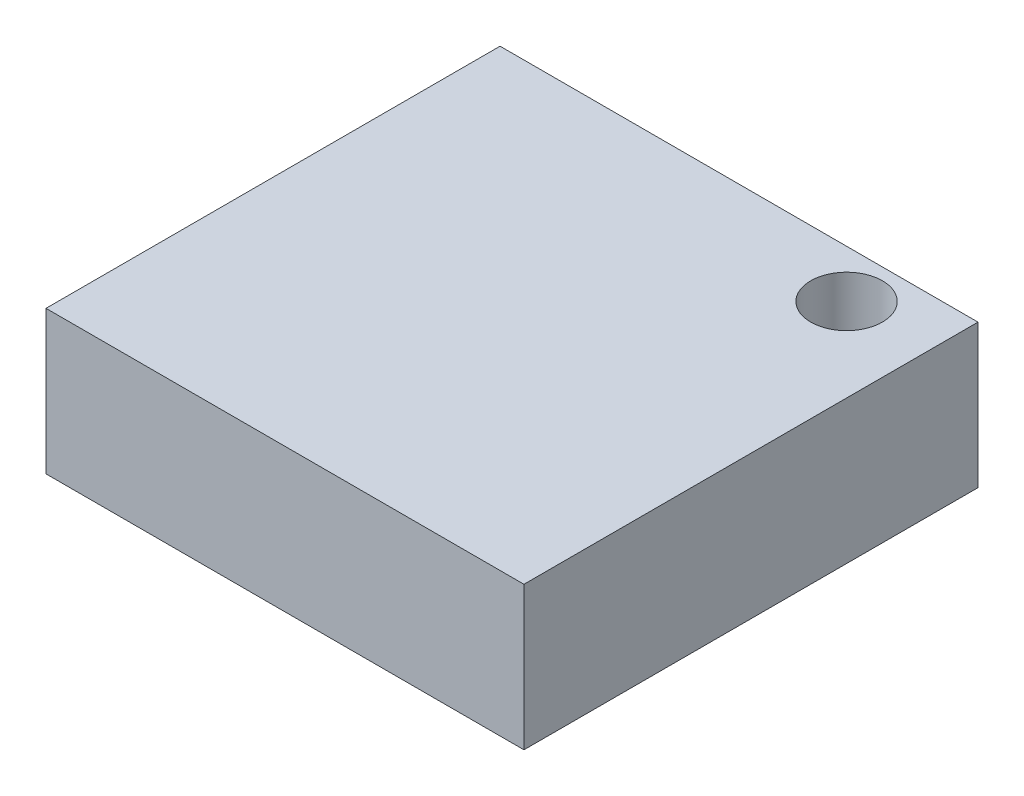
ISO-10303-21;
HEADER;
FILE_DESCRIPTION(('STEP AP214'),'2;1');
FILE_NAME('part.step','',(''),(''),'','','');
FILE_SCHEMA(('AUTOMOTIVE_DESIGN { 1 0 10303 214 1 1 1 1 }'));
ENDSEC;
DATA;
#1=APPLICATION_CONTEXT('core data for automotive mechanical design processes');
#2=APPLICATION_PROTOCOL_DEFINITION('international standard','automotive_design',2000,#1);
#3=PRODUCT_CONTEXT('',#1,'mechanical');
#4=PRODUCT('Part','Part','',(#3));
#5=PRODUCT_RELATED_PRODUCT_CATEGORY('part','',(#4));
#6=PRODUCT_DEFINITION_FORMATION('','',#4);
#7=PRODUCT_DEFINITION_CONTEXT('part definition',#1,'design');
#8=PRODUCT_DEFINITION('design','',#6,#7);
#9=PRODUCT_DEFINITION_SHAPE('','',#8);
#10=(LENGTH_UNIT() NAMED_UNIT(*) SI_UNIT(.MILLI.,.METRE.));
#11=(NAMED_UNIT(*) PLANE_ANGLE_UNIT() SI_UNIT($,.RADIAN.));
#12=(NAMED_UNIT(*) SI_UNIT($,.STERADIAN.) SOLID_ANGLE_UNIT());
#13=UNCERTAINTY_MEASURE_WITH_UNIT(LENGTH_MEASURE(1.E-05),#10,'distance_accuracy_value','');
#14=(GEOMETRIC_REPRESENTATION_CONTEXT(3) GLOBAL_UNCERTAINTY_ASSIGNED_CONTEXT((#13)) GLOBAL_UNIT_ASSIGNED_CONTEXT((#10,
#11,#12)) REPRESENTATION_CONTEXT('',''));
#15=CARTESIAN_POINT('',(0.,0.,0.));
#16=DIRECTION('',(0.,0.,1.));
#17=DIRECTION('',(1.,0.,0.));
#18=AXIS2_PLACEMENT_3D('',#15,#16,#17);
#19=CARTESIAN_POINT('',(0.,6.,0.));
#20=DIRECTION('',(1.,0.,0.));
#21=DIRECTION('',(0.,0.,-1.));
#22=AXIS2_PLACEMENT_3D('',#19,#20,#21);
#23=PLANE('',#22);
#24=DIRECTION('',(0.,0.,1.));
#25=VECTOR('',#24,1.);
#26=CARTESIAN_POINT('',(0.,0.,0.));
#27=LINE('',#26,#25);
#28=CARTESIAN_POINT('',(0.,0.,-19.));
#29=VERTEX_POINT('',#28);
#30=CARTESIAN_POINT('',(0.,0.,0.));
#31=VERTEX_POINT('',#30);
#32=EDGE_CURVE('E98',#29,#31,#27,.T.);
#33=ORIENTED_EDGE('',*,*,#32,.T.);
#34=DIRECTION('',(0.,-1.,0.));
#35=VECTOR('',#34,1.);
#36=CARTESIAN_POINT('',(0.,6.,0.));
#37=LINE('',#36,#35);
#38=CARTESIAN_POINT('',(0.,6.,0.));
#39=VERTEX_POINT('',#38);
#40=EDGE_CURVE('E11',#39,#31,#37,.T.);
#41=ORIENTED_EDGE('',*,*,#40,.F.);
#42=DIRECTION('',(0.,0.,1.));
#43=VECTOR('',#42,1.);
#44=CARTESIAN_POINT('',(0.,6.,0.));
#45=LINE('',#44,#43);
#46=CARTESIAN_POINT('',(0.,6.,-19.));
#47=VERTEX_POINT('',#46);
#48=EDGE_CURVE('E86',#47,#39,#45,.T.);
#49=ORIENTED_EDGE('',*,*,#48,.F.);
#50=DIRECTION('',(0.,-1.,0.));
#51=VECTOR('',#50,1.);
#52=CARTESIAN_POINT('',(0.,6.,-19.));
#53=LINE('',#52,#51);
#54=EDGE_CURVE('E94',#47,#29,#53,.T.);
#55=ORIENTED_EDGE('',*,*,#54,.T.);
#56=EDGE_LOOP('',(#33,#41,#49,#55));
#57=FACE_BOUND('',#56,.T.);
#58=ADVANCED_FACE('F35',(#57),#23,.F.);
#59=CARTESIAN_POINT('',(0.,6.,0.));
#60=DIRECTION('',(0.,0.,-1.));
#61=DIRECTION('',(-1.,0.,0.));
#62=AXIS2_PLACEMENT_3D('',#59,#60,#61);
#63=PLANE('',#62);
#64=DIRECTION('',(1.,0.,0.));
#65=VECTOR('',#64,1.);
#66=CARTESIAN_POINT('',(0.,0.,0.));
#67=LINE('',#66,#65);
#68=CARTESIAN_POINT('',(20.,0.,0.));
#69=VERTEX_POINT('',#68);
#70=EDGE_CURVE('E90',#31,#69,#67,.T.);
#71=ORIENTED_EDGE('',*,*,#70,.T.);
#72=DIRECTION('',(0.,-1.,0.));
#73=VECTOR('',#72,1.);
#74=CARTESIAN_POINT('',(20.,6.,0.));
#75=LINE('',#74,#73);
#76=CARTESIAN_POINT('',(20.,6.,0.));
#77=VERTEX_POINT('',#76);
#78=EDGE_CURVE('E43',#77,#69,#75,.T.);
#79=ORIENTED_EDGE('',*,*,#78,.F.);
#80=DIRECTION('',(1.,0.,0.));
#81=VECTOR('',#80,1.);
#82=CARTESIAN_POINT('',(0.,6.,0.));
#83=LINE('',#82,#81);
#84=EDGE_CURVE('E81',#39,#77,#83,.T.);
#85=ORIENTED_EDGE('',*,*,#84,.F.);
#86=ORIENTED_EDGE('',*,*,#40,.T.);
#87=EDGE_LOOP('',(#71,#79,#85,#86));
#88=FACE_BOUND('',#87,.T.);
#89=ADVANCED_FACE('F89',(#88),#63,.F.);
#90=CARTESIAN_POINT('',(20.,6.,0.));
#91=DIRECTION('',(-1.,0.,0.));
#92=DIRECTION('',(0.,0.,1.));
#93=AXIS2_PLACEMENT_3D('',#90,#91,#92);
#94=PLANE('',#93);
#95=DIRECTION('',(0.,0.,-1.));
#96=VECTOR('',#95,1.);
#97=CARTESIAN_POINT('',(20.,0.,0.));
#98=LINE('',#97,#96);
#99=CARTESIAN_POINT('',(20.,0.,-19.));
#100=VERTEX_POINT('',#99);
#101=EDGE_CURVE('E68',#69,#100,#98,.T.);
#102=ORIENTED_EDGE('',*,*,#101,.T.);
#103=DIRECTION('',(0.,-1.,0.));
#104=VECTOR('',#103,1.);
#105=CARTESIAN_POINT('',(20.,6.,-19.));
#106=LINE('',#105,#104);
#107=CARTESIAN_POINT('',(20.,6.,-19.));
#108=VERTEX_POINT('',#107);
#109=EDGE_CURVE('E91',#108,#100,#106,.T.);
#110=ORIENTED_EDGE('',*,*,#109,.F.);
#111=DIRECTION('',(0.,0.,-1.));
#112=VECTOR('',#111,1.);
#113=CARTESIAN_POINT('',(20.,6.,0.));
#114=LINE('',#113,#112);
#115=EDGE_CURVE('E84',#77,#108,#114,.T.);
#116=ORIENTED_EDGE('',*,*,#115,.F.);
#117=ORIENTED_EDGE('',*,*,#78,.T.);
#118=EDGE_LOOP('',(#102,#110,#116,#117));
#119=FACE_BOUND('',#118,.T.);
#120=ADVANCED_FACE('F92',(#119),#94,.F.);
#121=CARTESIAN_POINT('',(0.,6.,-19.));
#122=DIRECTION('',(0.,0.,1.));
#123=DIRECTION('',(1.,0.,0.));
#124=AXIS2_PLACEMENT_3D('',#121,#122,#123);
#125=PLANE('',#124);
#126=DIRECTION('',(-1.,0.,0.));
#127=VECTOR('',#126,1.);
#128=CARTESIAN_POINT('',(0.,0.,-19.));
#129=LINE('',#128,#127);
#130=EDGE_CURVE('E74',#100,#29,#129,.T.);
#131=ORIENTED_EDGE('',*,*,#130,.T.);
#132=ORIENTED_EDGE('',*,*,#54,.F.);
#133=DIRECTION('',(-1.,0.,0.));
#134=VECTOR('',#133,1.);
#135=CARTESIAN_POINT('',(0.,6.,-19.));
#136=LINE('',#135,#134);
#137=EDGE_CURVE('E51',#108,#47,#136,.T.);
#138=ORIENTED_EDGE('',*,*,#137,.F.);
#139=ORIENTED_EDGE('',*,*,#109,.T.);
#140=EDGE_LOOP('',(#131,#132,#138,#139));
#141=FACE_BOUND('',#140,.T.);
#142=ADVANCED_FACE('F106',(#141),#125,.F.);
#143=CARTESIAN_POINT('',(0.,6.,0.));
#144=DIRECTION('',(0.,-1.,0.));
#145=DIRECTION('',(0.,0.,-1.));
#146=AXIS2_PLACEMENT_3D('',#143,#144,#145);
#147=PLANE('',#146);
#148=CARTESIAN_POINT('',(16.5,6.,-17.));
#149=DIRECTION('',(0.,1.,0.));
#150=DIRECTION('',(0.,0.,1.));
#151=AXIS2_PLACEMENT_3D('',#148,#149,#150);
#152=CIRCLE('',#151,1.5);
#153=CARTESIAN_POINT('',(16.5,6.,-15.5));
#154=VERTEX_POINT('',#153);
#155=EDGE_CURVE('E112',#154,#154,#152,.T.);
#156=ORIENTED_EDGE('',*,*,#155,.F.);
#157=EDGE_LOOP('',(#156));
#158=FACE_BOUND('',#157,.T.);
#159=ORIENTED_EDGE('',*,*,#48,.T.);
#160=ORIENTED_EDGE('',*,*,#84,.T.);
#161=ORIENTED_EDGE('',*,*,#115,.T.);
#162=ORIENTED_EDGE('',*,*,#137,.T.);
#163=EDGE_LOOP('',(#159,#160,#161,#162));
#164=FACE_BOUND('',#163,.T.);
#165=ADVANCED_FACE('F82',(#158,#164),#147,.F.);
#166=CARTESIAN_POINT('',(0.,0.,0.));
#167=DIRECTION('',(0.,-1.,0.));
#168=DIRECTION('',(0.,0.,-1.));
#169=AXIS2_PLACEMENT_3D('',#166,#167,#168);
#170=PLANE('',#169);
#171=CARTESIAN_POINT('',(16.5,0.,-17.));
#172=DIRECTION('',(0.,1.,0.));
#173=DIRECTION('',(0.,0.,1.));
#174=AXIS2_PLACEMENT_3D('',#171,#172,#173);
#175=CIRCLE('',#174,1.5);
#176=CARTESIAN_POINT('',(16.5,0.,-15.5));
#177=VERTEX_POINT('',#176);
#178=EDGE_CURVE('E101',#177,#177,#175,.T.);
#179=ORIENTED_EDGE('',*,*,#178,.T.);
#180=EDGE_LOOP('',(#179));
#181=FACE_BOUND('',#180,.T.);
#182=ORIENTED_EDGE('',*,*,#32,.F.);
#183=ORIENTED_EDGE('',*,*,#130,.F.);
#184=ORIENTED_EDGE('',*,*,#101,.F.);
#185=ORIENTED_EDGE('',*,*,#70,.F.);
#186=EDGE_LOOP('',(#182,#183,#184,#185));
#187=FACE_BOUND('',#186,.T.);
#188=ADVANCED_FACE('F109',(#181,#187),#170,.T.);
#189=CARTESIAN_POINT('',(16.5,0.,-17.));
#190=DIRECTION('',(0.,1.,0.));
#191=DIRECTION('',(0.,0.,1.));
#192=AXIS2_PLACEMENT_3D('',#189,#190,#191);
#193=CYLINDRICAL_SURFACE('',#192,1.5);
#194=ORIENTED_EDGE('',*,*,#178,.F.);
#195=EDGE_LOOP('',(#194));
#196=FACE_BOUND('',#195,.T.);
#197=ORIENTED_EDGE('',*,*,#155,.T.);
#198=EDGE_LOOP('',(#197));
#199=FACE_BOUND('',#198,.T.);
#200=ADVANCED_FACE('F119',(#196,#199),#193,.F.);
#201=CLOSED_SHELL('',(#58,#89,#120,#142,#165,#188,#200));
#202=MANIFOLD_SOLID_BREP('B2',#201);
#203=ADVANCED_BREP_SHAPE_REPRESENTATION('',(#18,#202),#14);
#204=SHAPE_DEFINITION_REPRESENTATION(#9,#203);
ENDSEC;
END-ISO-10303-21;
